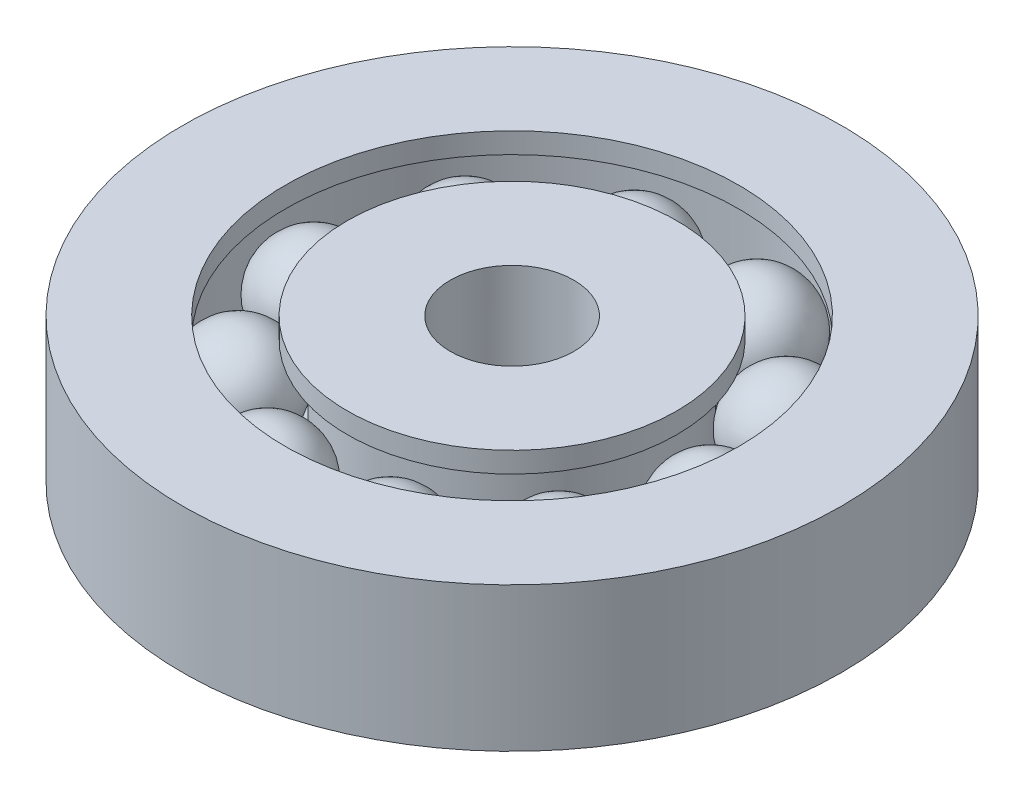
ISO-10303-21;
HEADER;
FILE_DESCRIPTION(('STEP AP214'),'2;1');
FILE_NAME('part.step','',(''),(''),'','','');
FILE_SCHEMA(('AUTOMOTIVE_DESIGN { 1 0 10303 214 1 1 1 1 }'));
ENDSEC;
DATA;
#1=APPLICATION_CONTEXT('core data for automotive mechanical design processes');
#2=APPLICATION_PROTOCOL_DEFINITION('international standard','automotive_design',2000,#1);
#3=PRODUCT_CONTEXT('',#1,'mechanical');
#4=PRODUCT('Part','Part','',(#3));
#5=PRODUCT_RELATED_PRODUCT_CATEGORY('part','',(#4));
#6=PRODUCT_DEFINITION_FORMATION('','',#4);
#7=PRODUCT_DEFINITION_CONTEXT('part definition',#1,'design');
#8=PRODUCT_DEFINITION('design','',#6,#7);
#9=PRODUCT_DEFINITION_SHAPE('','',#8);
#10=(LENGTH_UNIT() NAMED_UNIT(*) SI_UNIT(.MILLI.,.METRE.));
#11=(NAMED_UNIT(*) PLANE_ANGLE_UNIT() SI_UNIT($,.RADIAN.));
#12=(NAMED_UNIT(*) SI_UNIT($,.STERADIAN.) SOLID_ANGLE_UNIT());
#13=UNCERTAINTY_MEASURE_WITH_UNIT(LENGTH_MEASURE(1.E-05),#10,'distance_accuracy_value','');
#14=(GEOMETRIC_REPRESENTATION_CONTEXT(3) GLOBAL_UNCERTAINTY_ASSIGNED_CONTEXT((#13)) GLOBAL_UNIT_ASSIGNED_CONTEXT((#10,
#11,#12)) REPRESENTATION_CONTEXT('',''));
#15=CARTESIAN_POINT('',(0.,0.,0.));
#16=DIRECTION('',(0.,0.,1.));
#17=DIRECTION('',(1.,0.,0.));
#18=AXIS2_PLACEMENT_3D('',#15,#16,#17);
#19=CARTESIAN_POINT('',(-22.2404953298703,-3.00048086855819,40.9683645305579));
#20=DIRECTION('',(0.,-1.,0.));
#21=DIRECTION('',(0.,0.,1.));
#22=AXIS2_PLACEMENT_3D('',#19,#20,#21);
#23=SPHERICAL_SURFACE('',#22,5.);
#24=CARTESIAN_POINT('',(-22.2404953298703,-8.00048086855819,40.9683645305579));
#25=VERTEX_POINT('',#24);
#26=VERTEX_LOOP('',#25);
#27=FACE_BOUND('',#26,.T.);
#28=ADVANCED_FACE('P0_F13',(#27),#23,.T.);
#29=CLOSED_SHELL('',(#28));
#30=MANIFOLD_SOLID_BREP('P0_B1',#29);
#31=CARTESIAN_POINT('',(-26.0202538951115,-3.00048086855819,29.8506689397542));
#32=DIRECTION('',(0.,-1.,0.));
#33=DIRECTION('',(0.587785252292474,0.,0.809016994374947));
#34=AXIS2_PLACEMENT_3D('',#31,#32,#33);
#35=SPHERICAL_SURFACE('',#34,5.);
#36=CARTESIAN_POINT('',(-26.0202538951115,-8.00048086855819,29.8506689397542));
#37=VERTEX_POINT('',#36);
#38=VERTEX_LOOP('',#37);
#39=FACE_BOUND('',#38,.T.);
#40=ADVANCED_FACE('P1_F13',(#39),#35,.T.);
#41=CLOSED_SHELL('',(#40));
#42=MANIFOLD_SOLID_BREP('P1_B1',#41);
#43=CARTESIAN_POINT('',(-35.6129603167773,-3.00048086855818,23.0779506103816));
#44=DIRECTION('',(0.,-1.,0.));
#45=DIRECTION('',(0.951056516295154,0.,0.309016994374945));
#46=AXIS2_PLACEMENT_3D('',#43,#44,#45);
#47=SPHERICAL_SURFACE('',#46,5.);
#48=CARTESIAN_POINT('',(-35.6129603167773,-8.00048086855818,23.0779506103816));
#49=VERTEX_POINT('',#48);
#50=VERTEX_LOOP('',#49);
#51=FACE_BOUND('',#50,.T.);
#52=ADVANCED_FACE('P2_F13',(#51),#47,.T.);
#53=CLOSED_SHELL('',(#52));
#54=MANIFOLD_SOLID_BREP('P2_B1',#53);
#55=CARTESIAN_POINT('',(-47.3545267858907,-3.00048086855818,23.237157748031));
#56=DIRECTION('',(0.,-1.,0.));
#57=DIRECTION('',(0.951056516295153,0.,-0.309016994374951));
#58=AXIS2_PLACEMENT_3D('',#55,#56,#57);
#59=SPHERICAL_SURFACE('',#58,5.);
#60=CARTESIAN_POINT('',(-47.3545267858907,-8.00048086855818,23.237157748031));
#61=VERTEX_POINT('',#60);
#62=VERTEX_LOOP('',#61);
#63=FACE_BOUND('',#62,.T.);
#64=ADVANCED_FACE('P3_F13',(#63),#59,.T.);
#65=CLOSED_SHELL('',(#64));
#66=MANIFOLD_SOLID_BREP('P3_B1',#65);
#67=CARTESIAN_POINT('',(-56.7600739924166,-3.00048086855819,30.2674786373718));
#68=DIRECTION('',(0.,-1.,0.));
#69=DIRECTION('',(0.58778525229247,0.,-0.80901699437495));
#70=AXIS2_PLACEMENT_3D('',#67,#68,#69);
#71=SPHERICAL_SURFACE('',#70,5.);
#72=CARTESIAN_POINT('',(-56.7600739924166,-8.00048086855819,30.2674786373718));
#73=VERTEX_POINT('',#72);
#74=VERTEX_LOOP('',#73);
#75=FACE_BOUND('',#74,.T.);
#76=ADVANCED_FACE('P4_F13',(#75),#71,.T.);
#77=CLOSED_SHELL('',(#76));
#78=MANIFOLD_SOLID_BREP('P4_B1',#77);
#79=CARTESIAN_POINT('',(-60.2370025862536,-3.00048086855819,41.4835696504943));
#80=DIRECTION('',(0.,-1.,0.));
#81=DIRECTION('',(0.,0.,-1.));
#82=AXIS2_PLACEMENT_3D('',#79,#80,#81);
#83=SPHERICAL_SURFACE('',#82,5.);
#84=CARTESIAN_POINT('',(-60.2370025862536,-8.00048086855819,41.4835696504943));
#85=VERTEX_POINT('',#84);
#86=VERTEX_LOOP('',#85);
#87=FACE_BOUND('',#86,.T.);
#88=ADVANCED_FACE('P5_F13',(#87),#83,.T.);
#89=CLOSED_SHELL('',(#88));
#90=MANIFOLD_SOLID_BREP('P5_B1',#89);
#91=CARTESIAN_POINT('',(-56.4572440210124,-3.00048086855819,52.6012652412979));
#92=DIRECTION('',(0.,-1.,0.));
#93=DIRECTION('',(-0.587785252292478,0.,-0.809016994374944));
#94=AXIS2_PLACEMENT_3D('',#91,#92,#93);
#95=SPHERICAL_SURFACE('',#94,5.);
#96=CARTESIAN_POINT('',(-56.4572440210124,-8.00048086855819,52.6012652412979));
#97=VERTEX_POINT('',#96);
#98=VERTEX_LOOP('',#97);
#99=FACE_BOUND('',#98,.T.);
#100=ADVANCED_FACE('P6_F13',(#99),#95,.T.);
#101=CLOSED_SHELL('',(#100));
#102=MANIFOLD_SOLID_BREP('P6_B1',#101);
#103=CARTESIAN_POINT('',(-46.8645375993465,-3.00048086855819,59.3739835706704));
#104=DIRECTION('',(0.,-1.,0.));
#105=DIRECTION('',(-0.951056516295156,0.,-0.30901699437494));
#106=AXIS2_PLACEMENT_3D('',#103,#104,#105);
#107=SPHERICAL_SURFACE('',#106,5.);
#108=CARTESIAN_POINT('',(-46.8645375993465,-8.00048086855819,59.3739835706704));
#109=VERTEX_POINT('',#108);
#110=VERTEX_LOOP('',#109);
#111=FACE_BOUND('',#110,.T.);
#112=ADVANCED_FACE('P7_F13',(#111),#107,.T.);
#113=CLOSED_SHELL('',(#112));
#114=MANIFOLD_SOLID_BREP('P7_B1',#113);
#115=CARTESIAN_POINT('',(-35.122971130233,-3.00048086855819,59.214776433021));
#116=DIRECTION('',(0.,-1.,0.));
#117=DIRECTION('',(-0.951056516295151,0.,0.309016994374956));
#118=AXIS2_PLACEMENT_3D('',#115,#116,#117);
#119=SPHERICAL_SURFACE('',#118,5.);
#120=CARTESIAN_POINT('',(-35.122971130233,-8.00048086855819,59.214776433021));
#121=VERTEX_POINT('',#120);
#122=VERTEX_LOOP('',#121);
#123=FACE_BOUND('',#122,.T.);
#124=ADVANCED_FACE('P8_F13',(#123),#119,.T.);
#125=CLOSED_SHELL('',(#124));
#126=MANIFOLD_SOLID_BREP('P8_B1',#125);
#127=CARTESIAN_POINT('',(-25.7174239237072,-3.00048086855819,52.1844555436802));
#128=DIRECTION('',(0.,-1.,0.));
#129=DIRECTION('',(-0.587785252292465,0.,0.809016994374953));
#130=AXIS2_PLACEMENT_3D('',#127,#128,#129);
#131=SPHERICAL_SURFACE('',#130,5.);
#132=CARTESIAN_POINT('',(-25.7174239237072,-8.00048086855819,52.1844555436802));
#133=VERTEX_POINT('',#132);
#134=VERTEX_LOOP('',#133);
#135=FACE_BOUND('',#134,.T.);
#136=ADVANCED_FACE('P9_F12',(#135),#131,.T.);
#137=CLOSED_SHELL('',(#136));
#138=MANIFOLD_SOLID_BREP('P9_B1',#137);
#139=CARTESIAN_POINT('',(-41.2387489580619,2.59107728832987,41.225967090526));
#140=DIRECTION('',(0.,1.,0.));
#141=DIRECTION('',(1.,0.,0.));
#142=AXIS2_PLACEMENT_3D('',#139,#140,#141);
#143=PLANE('',#142);
#144=CARTESIAN_POINT('',(-41.2387489580619,2.59107728832987,41.225967090526));
#145=DIRECTION('',(0.,1.,0.));
#146=DIRECTION('',(1.,0.,0.));
#147=AXIS2_PLACEMENT_3D('',#144,#145,#146);
#148=CIRCLE('',#147,22.);
#149=CARTESIAN_POINT('',(-19.238748958062,2.59107728832987,41.225967090526));
#150=VERTEX_POINT('',#149);
#151=EDGE_CURVE('P10_E35',#150,#150,#148,.T.);
#152=ORIENTED_EDGE('',*,*,#151,.T.);
#153=EDGE_LOOP('',(#152));
#154=FACE_BOUND('',#153,.T.);
#155=CARTESIAN_POINT('',(-41.2387489580619,2.59107728832987,41.225967090526));
#156=DIRECTION('',(0.,1.,0.));
#157=DIRECTION('',(1.,0.,0.));
#158=AXIS2_PLACEMENT_3D('',#155,#156,#157);
#159=CIRCLE('',#158,24.);
#160=CARTESIAN_POINT('',(-17.2387489580619,2.59107728832987,41.225967090526));
#161=VERTEX_POINT('',#160);
#162=EDGE_CURVE('P10_E10',#161,#161,#159,.F.);
#163=ORIENTED_EDGE('',*,*,#162,.T.);
#164=EDGE_LOOP('',(#163));
#165=FACE_BOUND('',#164,.T.);
#166=ADVANCED_FACE('P10_F15',(#154,#165),#143,.F.);
#167=CARTESIAN_POINT('',(-41.2387489580619,-7.40892271167013,41.225967090526));
#168=DIRECTION('',(0.,1.,0.));
#169=DIRECTION('',(1.,0.,0.));
#170=AXIS2_PLACEMENT_3D('',#167,#168,#169);
#171=CYLINDRICAL_SURFACE('',#170,24.);
#172=CARTESIAN_POINT('',(-41.2387489580619,-7.40892271167013,41.225967090526));
#173=DIRECTION('',(0.,1.,0.));
#174=DIRECTION('',(1.,0.,0.));
#175=AXIS2_PLACEMENT_3D('',#172,#173,#174);
#176=CIRCLE('',#175,24.);
#177=CARTESIAN_POINT('',(-17.2387489580619,-7.40892271167013,41.225967090526));
#178=VERTEX_POINT('',#177);
#179=EDGE_CURVE('P10_E31',#178,#178,#176,.T.);
#180=ORIENTED_EDGE('',*,*,#179,.F.);
#181=EDGE_LOOP('',(#180));
#182=FACE_BOUND('',#181,.T.);
#183=ORIENTED_EDGE('',*,*,#162,.F.);
#184=EDGE_LOOP('',(#183));
#185=FACE_BOUND('',#184,.T.);
#186=ADVANCED_FACE('P10_F61',(#182,#185),#171,.F.);
#187=CARTESIAN_POINT('',(-41.2387489580619,-7.40892271167013,41.225967090526));
#188=DIRECTION('',(0.,1.,0.));
#189=DIRECTION('',(1.,0.,0.));
#190=AXIS2_PLACEMENT_3D('',#187,#188,#189);
#191=PLANE('',#190);
#192=CARTESIAN_POINT('',(-41.2387489580619,-7.40892271167013,41.225967090526));
#193=DIRECTION('',(0.,1.,0.));
#194=DIRECTION('',(1.,0.,0.));
#195=AXIS2_PLACEMENT_3D('',#192,#193,#194);
#196=CIRCLE('',#195,22.);
#197=CARTESIAN_POINT('',(-19.238748958062,-7.40892271167013,41.225967090526));
#198=VERTEX_POINT('',#197);
#199=EDGE_CURVE('P10_E39',#198,#198,#196,.T.);
#200=ORIENTED_EDGE('',*,*,#199,.F.);
#201=EDGE_LOOP('',(#200));
#202=FACE_BOUND('',#201,.T.);
#203=ORIENTED_EDGE('',*,*,#179,.T.);
#204=EDGE_LOOP('',(#203));
#205=FACE_BOUND('',#204,.T.);
#206=ADVANCED_FACE('P10_F67',(#202,#205),#191,.T.);
#207=CARTESIAN_POINT('',(-41.2387489580619,2.59107728832987,41.225967090526));
#208=DIRECTION('',(0.,1.,0.));
#209=DIRECTION('',(1.,0.,0.));
#210=AXIS2_PLACEMENT_3D('',#207,#208,#209);
#211=CYLINDRICAL_SURFACE('',#210,22.);
#212=ORIENTED_EDGE('',*,*,#151,.F.);
#213=EDGE_LOOP('',(#212));
#214=FACE_BOUND('',#213,.T.);
#215=CARTESIAN_POINT('',(-41.2387489580619,4.59107728832987,41.225967090526));
#216=DIRECTION('',(0.,1.,0.));
#217=DIRECTION('',(1.,0.,0.));
#218=AXIS2_PLACEMENT_3D('',#215,#216,#217);
#219=CIRCLE('',#218,22.);
#220=CARTESIAN_POINT('',(-19.238748958062,4.59107728832987,41.225967090526));
#221=VERTEX_POINT('',#220);
#222=EDGE_CURVE('P10_E36',#221,#221,#219,.T.);
#223=ORIENTED_EDGE('',*,*,#222,.T.);
#224=EDGE_LOOP('',(#223));
#225=FACE_BOUND('',#224,.T.);
#226=ADVANCED_FACE('P10_F71',(#214,#225),#211,.F.);
#227=CARTESIAN_POINT('',(-41.2387489580619,4.59107728832987,41.225967090526));
#228=DIRECTION('',(0.,1.,0.));
#229=DIRECTION('',(1.,0.,0.));
#230=AXIS2_PLACEMENT_3D('',#227,#228,#229);
#231=PLANE('',#230);
#232=CARTESIAN_POINT('',(-41.2387489580619,4.59107728832987,41.225967090526));
#233=DIRECTION('',(0.,1.,0.));
#234=DIRECTION('',(1.,0.,0.));
#235=AXIS2_PLACEMENT_3D('',#232,#233,#234);
#236=CIRCLE('',#235,32.);
#237=CARTESIAN_POINT('',(-9.23874895806195,4.59107728832987,41.225967090526));
#238=VERTEX_POINT('',#237);
#239=EDGE_CURVE('P10_E22',#238,#238,#236,.T.);
#240=ORIENTED_EDGE('',*,*,#239,.T.);
#241=EDGE_LOOP('',(#240));
#242=FACE_BOUND('',#241,.T.);
#243=ORIENTED_EDGE('',*,*,#222,.F.);
#244=EDGE_LOOP('',(#243));
#245=FACE_BOUND('',#244,.T.);
#246=ADVANCED_FACE('P10_F75',(#242,#245),#231,.T.);
#247=CARTESIAN_POINT('',(-41.2387489580619,4.59107728832987,41.225967090526));
#248=DIRECTION('',(0.,-1.,0.));
#249=DIRECTION('',(-1.,0.,0.));
#250=AXIS2_PLACEMENT_3D('',#247,#248,#249);
#251=CYLINDRICAL_SURFACE('',#250,32.);
#252=ORIENTED_EDGE('',*,*,#239,.F.);
#253=EDGE_LOOP('',(#252));
#254=FACE_BOUND('',#253,.T.);
#255=CARTESIAN_POINT('',(-41.2387489580619,-9.40892271167013,41.225967090526));
#256=DIRECTION('',(0.,1.,0.));
#257=DIRECTION('',(1.,0.,0.));
#258=AXIS2_PLACEMENT_3D('',#255,#256,#257);
#259=CIRCLE('',#258,32.);
#260=CARTESIAN_POINT('',(-9.23874895806195,-9.40892271167013,41.225967090526));
#261=VERTEX_POINT('',#260);
#262=EDGE_CURVE('P10_E26',#261,#261,#259,.T.);
#263=ORIENTED_EDGE('',*,*,#262,.T.);
#264=EDGE_LOOP('',(#263));
#265=FACE_BOUND('',#264,.T.);
#266=ADVANCED_FACE('P10_F17',(#254,#265),#251,.T.);
#267=CARTESIAN_POINT('',(-41.2387489580619,-9.40892271167013,41.225967090526));
#268=DIRECTION('',(0.,1.,0.));
#269=DIRECTION('',(1.,0.,0.));
#270=AXIS2_PLACEMENT_3D('',#267,#268,#269);
#271=PLANE('',#270);
#272=CARTESIAN_POINT('',(-41.2387489580619,-9.40892271167013,41.225967090526));
#273=DIRECTION('',(0.,1.,0.));
#274=DIRECTION('',(1.,0.,0.));
#275=AXIS2_PLACEMENT_3D('',#272,#273,#274);
#276=CIRCLE('',#275,22.);
#277=CARTESIAN_POINT('',(-19.238748958062,-9.40892271167013,41.225967090526));
#278=VERTEX_POINT('',#277);
#279=EDGE_CURVE('P10_E44',#278,#278,#276,.T.);
#280=ORIENTED_EDGE('',*,*,#279,.T.);
#281=EDGE_LOOP('',(#280));
#282=FACE_BOUND('',#281,.T.);
#283=ORIENTED_EDGE('',*,*,#262,.F.);
#284=EDGE_LOOP('',(#283));
#285=FACE_BOUND('',#284,.T.);
#286=ADVANCED_FACE('P10_F48',(#282,#285),#271,.F.);
#287=CARTESIAN_POINT('',(-41.2387489580619,-63.4089227116702,41.225967090526));
#288=DIRECTION('',(0.,1.,0.));
#289=DIRECTION('',(1.,0.,0.));
#290=AXIS2_PLACEMENT_3D('',#287,#288,#289);
#291=CYLINDRICAL_SURFACE('',#290,22.);
#292=ORIENTED_EDGE('',*,*,#199,.T.);
#293=EDGE_LOOP('',(#292));
#294=FACE_BOUND('',#293,.T.);
#295=ORIENTED_EDGE('',*,*,#279,.F.);
#296=EDGE_LOOP('',(#295));
#297=FACE_BOUND('',#296,.T.);
#298=ADVANCED_FACE('P10_F51',(#294,#297),#291,.F.);
#299=CLOSED_SHELL('',(#166,#186,#206,#226,#246,#266,#286,#298));
#300=MANIFOLD_SOLID_BREP('P10_B1',#299);
#301=CARTESIAN_POINT('',(-41.2387489580619,-7.40892271167013,41.225967090526));
#302=DIRECTION('',(0.,1.,0.));
#303=DIRECTION('',(1.,0.,0.));
#304=AXIS2_PLACEMENT_3D('',#301,#302,#303);
#305=PLANE('',#304);
#306=CARTESIAN_POINT('',(-41.2387489580619,-7.40892271167013,41.225967090526));
#307=DIRECTION('',(0.,1.,0.));
#308=DIRECTION('',(1.,0.,0.));
#309=AXIS2_PLACEMENT_3D('',#306,#307,#308);
#310=CIRCLE('',#309,14.);
#311=CARTESIAN_POINT('',(-27.238748958062,-7.40892271167013,41.225967090526));
#312=VERTEX_POINT('',#311);
#313=EDGE_CURVE('P11_E34',#312,#312,#310,.T.);
#314=ORIENTED_EDGE('',*,*,#313,.F.);
#315=EDGE_LOOP('',(#314));
#316=FACE_BOUND('',#315,.T.);
#317=CARTESIAN_POINT('',(-41.2387489580619,-7.40892271167013,41.225967090526));
#318=DIRECTION('',(0.,1.,0.));
#319=DIRECTION('',(1.,0.,0.));
#320=AXIS2_PLACEMENT_3D('',#317,#318,#319);
#321=CIRCLE('',#320,16.);
#322=CARTESIAN_POINT('',(-25.2387489580619,-7.40892271167013,41.225967090526));
#323=VERTEX_POINT('',#322);
#324=EDGE_CURVE('P11_E19',#323,#323,#321,.T.);
#325=ORIENTED_EDGE('',*,*,#324,.T.);
#326=EDGE_LOOP('',(#325));
#327=FACE_BOUND('',#326,.T.);
#328=ADVANCED_FACE('P11_F15',(#316,#327),#305,.T.);
#329=CARTESIAN_POINT('',(-41.2387489580619,-7.40892271167013,41.225967090526));
#330=DIRECTION('',(0.,1.,0.));
#331=DIRECTION('',(1.,0.,0.));
#332=AXIS2_PLACEMENT_3D('',#329,#330,#331);
#333=CYLINDRICAL_SURFACE('',#332,14.);
#334=ORIENTED_EDGE('',*,*,#313,.T.);
#335=EDGE_LOOP('',(#334));
#336=FACE_BOUND('',#335,.T.);
#337=CARTESIAN_POINT('',(-41.2387489580619,2.59107728832987,41.225967090526));
#338=DIRECTION('',(0.,1.,0.));
#339=DIRECTION('',(1.,0.,0.));
#340=AXIS2_PLACEMENT_3D('',#337,#338,#339);
#341=CIRCLE('',#340,14.);
#342=CARTESIAN_POINT('',(-27.238748958062,2.59107728832987,41.225967090526));
#343=VERTEX_POINT('',#342);
#344=EDGE_CURVE('P11_E28',#343,#343,#341,.T.);
#345=ORIENTED_EDGE('',*,*,#344,.F.);
#346=EDGE_LOOP('',(#345));
#347=FACE_BOUND('',#346,.T.);
#348=ADVANCED_FACE('P11_F45',(#336,#347),#333,.T.);
#349=CARTESIAN_POINT('',(-41.2387489580619,2.59107728832987,41.225967090526));
#350=DIRECTION('',(0.,1.,0.));
#351=DIRECTION('',(1.,0.,0.));
#352=AXIS2_PLACEMENT_3D('',#349,#350,#351);
#353=CYLINDRICAL_SURFACE('',#352,16.);
#354=CARTESIAN_POINT('',(-41.2387489580619,2.59107728832987,41.225967090526));
#355=DIRECTION('',(0.,1.,0.));
#356=DIRECTION('',(1.,0.,0.));
#357=AXIS2_PLACEMENT_3D('',#354,#355,#356);
#358=CIRCLE('',#357,16.);
#359=CARTESIAN_POINT('',(-25.2387489580619,2.59107728832987,41.225967090526));
#360=VERTEX_POINT('',#359);
#361=EDGE_CURVE('P11_E36',#360,#360,#358,.T.);
#362=ORIENTED_EDGE('',*,*,#361,.T.);
#363=EDGE_LOOP('',(#362));
#364=FACE_BOUND('',#363,.T.);
#365=CARTESIAN_POINT('',(-41.2387489580619,4.59107728832987,41.225967090526));
#366=DIRECTION('',(0.,1.,0.));
#367=DIRECTION('',(1.,0.,0.));
#368=AXIS2_PLACEMENT_3D('',#365,#366,#367);
#369=CIRCLE('',#368,16.);
#370=CARTESIAN_POINT('',(-25.2387489580619,4.59107728832987,41.225967090526));
#371=VERTEX_POINT('',#370);
#372=EDGE_CURVE('P11_E23',#371,#371,#369,.T.);
#373=ORIENTED_EDGE('',*,*,#372,.F.);
#374=EDGE_LOOP('',(#373));
#375=FACE_BOUND('',#374,.T.);
#376=ADVANCED_FACE('P11_F47',(#364,#375),#353,.T.);
#377=CARTESIAN_POINT('',(-41.2387489580619,2.59107728832987,41.225967090526));
#378=DIRECTION('',(0.,1.,0.));
#379=DIRECTION('',(1.,0.,0.));
#380=AXIS2_PLACEMENT_3D('',#377,#378,#379);
#381=PLANE('',#380);
#382=ORIENTED_EDGE('',*,*,#344,.T.);
#383=EDGE_LOOP('',(#382));
#384=FACE_BOUND('',#383,.T.);
#385=ORIENTED_EDGE('',*,*,#361,.F.);
#386=EDGE_LOOP('',(#385));
#387=FACE_BOUND('',#386,.T.);
#388=ADVANCED_FACE('P11_F42',(#384,#387),#381,.F.);
#389=CARTESIAN_POINT('',(-41.2387489580619,4.59107728832987,41.225967090526));
#390=DIRECTION('',(0.,1.,0.));
#391=DIRECTION('',(1.,0.,0.));
#392=AXIS2_PLACEMENT_3D('',#389,#390,#391);
#393=PLANE('',#392);
#394=CARTESIAN_POINT('',(-41.2387489580619,4.59107728832986,41.225967090526));
#395=DIRECTION('',(0.,1.,0.));
#396=DIRECTION('',(1.,0.,0.));
#397=AXIS2_PLACEMENT_3D('',#394,#395,#396);
#398=CIRCLE('',#397,6.);
#399=CARTESIAN_POINT('',(-35.2387489580619,4.59107728832986,41.225967090526));
#400=VERTEX_POINT('',#399);
#401=EDGE_CURVE('P11_E32',#400,#400,#398,.T.);
#402=ORIENTED_EDGE('',*,*,#401,.F.);
#403=EDGE_LOOP('',(#402));
#404=FACE_BOUND('',#403,.T.);
#405=ORIENTED_EDGE('',*,*,#372,.T.);
#406=EDGE_LOOP('',(#405));
#407=FACE_BOUND('',#406,.T.);
#408=ADVANCED_FACE('P11_F64',(#404,#407),#393,.T.);
#409=CARTESIAN_POINT('',(-41.2387489580619,-63.4089227116702,41.225967090526));
#410=DIRECTION('',(0.,1.,0.));
#411=DIRECTION('',(1.,0.,0.));
#412=AXIS2_PLACEMENT_3D('',#409,#410,#411);
#413=CYLINDRICAL_SURFACE('',#412,16.);
#414=ORIENTED_EDGE('',*,*,#324,.F.);
#415=EDGE_LOOP('',(#414));
#416=FACE_BOUND('',#415,.T.);
#417=CARTESIAN_POINT('',(-41.2387489580619,-9.40892271167013,41.225967090526));
#418=DIRECTION('',(0.,1.,0.));
#419=DIRECTION('',(1.,0.,0.));
#420=AXIS2_PLACEMENT_3D('',#417,#418,#419);
#421=CIRCLE('',#420,16.);
#422=CARTESIAN_POINT('',(-25.2387489580619,-9.40892271167013,41.225967090526));
#423=VERTEX_POINT('',#422);
#424=EDGE_CURVE('P11_E10',#423,#423,#421,.T.);
#425=ORIENTED_EDGE('',*,*,#424,.T.);
#426=EDGE_LOOP('',(#425));
#427=FACE_BOUND('',#426,.T.);
#428=ADVANCED_FACE('P11_F65',(#416,#427),#413,.T.);
#429=CARTESIAN_POINT('',(-41.2387489580619,-9.40892271167013,41.225967090526));
#430=DIRECTION('',(0.,1.,0.));
#431=DIRECTION('',(1.,0.,0.));
#432=AXIS2_PLACEMENT_3D('',#429,#430,#431);
#433=PLANE('',#432);
#434=CARTESIAN_POINT('',(-41.2387489580619,-9.40892271167013,41.225967090526));
#435=DIRECTION('',(0.,-1.,0.));
#436=DIRECTION('',(-1.,0.,0.));
#437=AXIS2_PLACEMENT_3D('',#434,#435,#436);
#438=CIRCLE('',#437,6.);
#439=CARTESIAN_POINT('',(-47.2387489580619,-9.40892271167013,41.225967090526));
#440=VERTEX_POINT('',#439);
#441=EDGE_CURVE('P11_E78',#440,#440,#438,.T.);
#442=ORIENTED_EDGE('',*,*,#441,.F.);
#443=EDGE_LOOP('',(#442));
#444=FACE_BOUND('',#443,.T.);
#445=ORIENTED_EDGE('',*,*,#424,.F.);
#446=EDGE_LOOP('',(#445));
#447=FACE_BOUND('',#446,.T.);
#448=ADVANCED_FACE('P11_F17',(#444,#447),#433,.F.);
#449=CARTESIAN_POINT('',(-41.2387489580619,58.5910772883299,41.225967090526));
#450=DIRECTION('',(0.,-1.,0.));
#451=DIRECTION('',(-1.,0.,0.));
#452=AXIS2_PLACEMENT_3D('',#449,#450,#451);
#453=CYLINDRICAL_SURFACE('',#452,6.);
#454=ORIENTED_EDGE('',*,*,#401,.T.);
#455=EDGE_LOOP('',(#454));
#456=FACE_BOUND('',#455,.T.);
#457=ORIENTED_EDGE('',*,*,#441,.T.);
#458=EDGE_LOOP('',(#457));
#459=FACE_BOUND('',#458,.T.);
#460=ADVANCED_FACE('P11_F60',(#456,#459),#453,.F.);
#461=CLOSED_SHELL('',(#328,#348,#376,#388,#408,#428,#448,#460));
#462=MANIFOLD_SOLID_BREP('P11_B1',#461);
#463=ADVANCED_BREP_SHAPE_REPRESENTATION('',(#18,#30,#42,#54,#66,#78,#90,#102,#114,#126,#138,
#300,#462),#14);
#464=SHAPE_DEFINITION_REPRESENTATION(#9,#463);
ENDSEC;
END-ISO-10303-21;
